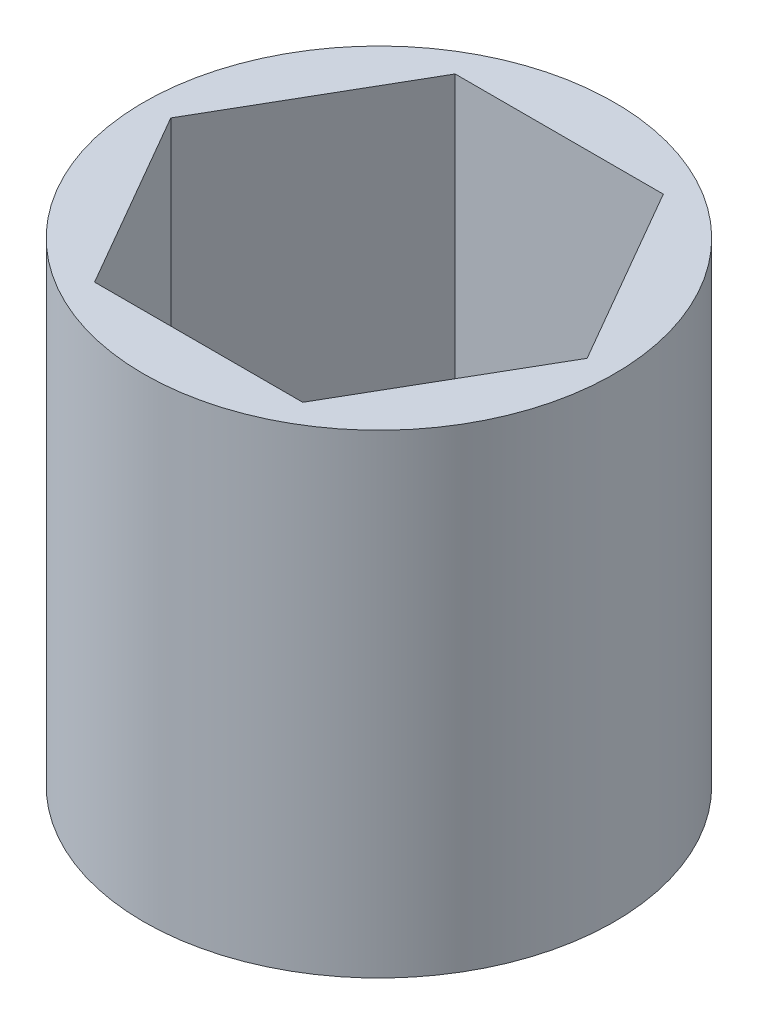
ISO-10303-21;
HEADER;
FILE_DESCRIPTION(('STEP AP214'),'2;1');
FILE_NAME('part.step','',(''),(''),'','','');
FILE_SCHEMA(('AUTOMOTIVE_DESIGN { 1 0 10303 214 1 1 1 1 }'));
ENDSEC;
DATA;
#1=APPLICATION_CONTEXT('core data for automotive mechanical design processes');
#2=APPLICATION_PROTOCOL_DEFINITION('international standard','automotive_design',2000,#1);
#3=PRODUCT_CONTEXT('',#1,'mechanical');
#4=PRODUCT('Part','Part','',(#3));
#5=PRODUCT_RELATED_PRODUCT_CATEGORY('part','',(#4));
#6=PRODUCT_DEFINITION_FORMATION('','',#4);
#7=PRODUCT_DEFINITION_CONTEXT('part definition',#1,'design');
#8=PRODUCT_DEFINITION('design','',#6,#7);
#9=PRODUCT_DEFINITION_SHAPE('','',#8);
#10=(LENGTH_UNIT() NAMED_UNIT(*) SI_UNIT(.MILLI.,.METRE.));
#11=(NAMED_UNIT(*) PLANE_ANGLE_UNIT() SI_UNIT($,.RADIAN.));
#12=(NAMED_UNIT(*) SI_UNIT($,.STERADIAN.) SOLID_ANGLE_UNIT());
#13=UNCERTAINTY_MEASURE_WITH_UNIT(LENGTH_MEASURE(1.E-05),#10,'distance_accuracy_value','');
#14=(GEOMETRIC_REPRESENTATION_CONTEXT(3) GLOBAL_UNCERTAINTY_ASSIGNED_CONTEXT((#13)) GLOBAL_UNIT_ASSIGNED_CONTEXT((#10,
#11,#12)) REPRESENTATION_CONTEXT('',''));
#15=CARTESIAN_POINT('',(0.,0.,0.));
#16=DIRECTION('',(0.,0.,1.));
#17=DIRECTION('',(1.,0.,0.));
#18=AXIS2_PLACEMENT_3D('',#15,#16,#17);
#19=CARTESIAN_POINT('',(0.,12.7,0.));
#20=DIRECTION('',(0.,1.,0.));
#21=DIRECTION('',(0.,0.,1.));
#22=AXIS2_PLACEMENT_3D('',#19,#20,#21);
#23=PLANE('',#22);
#24=CARTESIAN_POINT('',(0.,12.7,0.));
#25=DIRECTION('',(0.,1.,0.));
#26=DIRECTION('',(0.,0.,1.));
#27=AXIS2_PLACEMENT_3D('',#24,#25,#26);
#28=CIRCLE('',#27,6.2992);
#29=CARTESIAN_POINT('',(0.,12.7,6.2992));
#30=VERTEX_POINT('',#29);
#31=EDGE_CURVE('E11',#30,#30,#28,.T.);
#32=ORIENTED_EDGE('',*,*,#31,.T.);
#33=EDGE_LOOP('',(#32));
#34=FACE_BOUND('',#33,.T.);
#35=DIRECTION('',(-0.5,0.,-0.866025403784438));
#36=VECTOR('',#35,1.);
#37=CARTESIAN_POINT('',(5.57258479821827,12.7,0.));
#38=LINE('',#37,#36);
#39=CARTESIAN_POINT('',(5.57258479821827,12.7,0.));
#40=VERTEX_POINT('',#39);
#41=CARTESIAN_POINT('',(2.78629239910913,12.7,-4.826));
#42=VERTEX_POINT('',#41);
#43=EDGE_CURVE('E94',#40,#42,#38,.T.);
#44=ORIENTED_EDGE('',*,*,#43,.F.);
#45=DIRECTION('',(0.5,0.,-0.866025403784439));
#46=VECTOR('',#45,1.);
#47=CARTESIAN_POINT('',(2.78629239910914,12.7,4.826));
#48=LINE('',#47,#46);
#49=CARTESIAN_POINT('',(2.78629239910914,12.7,4.826));
#50=VERTEX_POINT('',#49);
#51=EDGE_CURVE('E86',#50,#40,#48,.T.);
#52=ORIENTED_EDGE('',*,*,#51,.F.);
#53=DIRECTION('',(1.,0.,0.));
#54=VECTOR('',#53,1.);
#55=CARTESIAN_POINT('',(-2.78629239910913,12.7,4.826));
#56=LINE('',#55,#54);
#57=CARTESIAN_POINT('',(-2.78629239910913,12.7,4.826));
#58=VERTEX_POINT('',#57);
#59=EDGE_CURVE('E114',#58,#50,#56,.T.);
#60=ORIENTED_EDGE('',*,*,#59,.F.);
#61=DIRECTION('',(0.5,0.,0.866025403784439));
#62=VECTOR('',#61,1.);
#63=CARTESIAN_POINT('',(-5.57258479821827,12.7,0.));
#64=LINE('',#63,#62);
#65=CARTESIAN_POINT('',(-5.57258479821827,12.7,0.));
#66=VERTEX_POINT('',#65);
#67=EDGE_CURVE('E112',#66,#58,#64,.T.);
#68=ORIENTED_EDGE('',*,*,#67,.F.);
#69=DIRECTION('',(-0.5,0.,0.866025403784439));
#70=VECTOR('',#69,1.);
#71=CARTESIAN_POINT('',(-2.78629239910914,12.7,-4.826));
#72=LINE('',#71,#70);
#73=CARTESIAN_POINT('',(-2.78629239910914,12.7,-4.826));
#74=VERTEX_POINT('',#73);
#75=EDGE_CURVE('E108',#74,#66,#72,.T.);
#76=ORIENTED_EDGE('',*,*,#75,.F.);
#77=DIRECTION('',(-1.,0.,0.));
#78=VECTOR('',#77,1.);
#79=CARTESIAN_POINT('',(2.78629239910913,12.7,-4.826));
#80=LINE('',#79,#78);
#81=EDGE_CURVE('E106',#42,#74,#80,.T.);
#82=ORIENTED_EDGE('',*,*,#81,.F.);
#83=EDGE_LOOP('',(#44,#52,#60,#68,#76,#82));
#84=FACE_BOUND('',#83,.T.);
#85=ADVANCED_FACE('F33',(#34,#84),#23,.T.);
#86=CARTESIAN_POINT('',(0.,0.,0.));
#87=DIRECTION('',(0.,1.,0.));
#88=DIRECTION('',(0.,0.,1.));
#89=AXIS2_PLACEMENT_3D('',#86,#87,#88);
#90=PLANE('',#89);
#91=CARTESIAN_POINT('',(0.,0.,0.));
#92=DIRECTION('',(0.,1.,0.));
#93=DIRECTION('',(0.,0.,1.));
#94=AXIS2_PLACEMENT_3D('',#91,#92,#93);
#95=CIRCLE('',#94,6.2992);
#96=CARTESIAN_POINT('',(0.,0.,6.2992));
#97=VERTEX_POINT('',#96);
#98=EDGE_CURVE('E37',#97,#97,#95,.T.);
#99=ORIENTED_EDGE('',*,*,#98,.F.);
#100=EDGE_LOOP('',(#99));
#101=FACE_BOUND('',#100,.T.);
#102=DIRECTION('',(0.5,0.,-0.866025403784439));
#103=VECTOR('',#102,1.);
#104=CARTESIAN_POINT('',(2.78629239910914,0.,4.826));
#105=LINE('',#104,#103);
#106=CARTESIAN_POINT('',(2.78629239910914,0.,4.826));
#107=VERTEX_POINT('',#106);
#108=CARTESIAN_POINT('',(5.57258479821827,0.,0.));
#109=VERTEX_POINT('',#108);
#110=EDGE_CURVE('E56',#107,#109,#105,.T.);
#111=ORIENTED_EDGE('',*,*,#110,.T.);
#112=DIRECTION('',(-0.5,0.,-0.866025403784438));
#113=VECTOR('',#112,1.);
#114=CARTESIAN_POINT('',(5.57258479821827,0.,0.));
#115=LINE('',#114,#113);
#116=CARTESIAN_POINT('',(2.78629239910913,0.,-4.826));
#117=VERTEX_POINT('',#116);
#118=EDGE_CURVE('E101',#109,#117,#115,.T.);
#119=ORIENTED_EDGE('',*,*,#118,.T.);
#120=DIRECTION('',(-1.,0.,0.));
#121=VECTOR('',#120,1.);
#122=CARTESIAN_POINT('',(2.78629239910913,0.,-4.826));
#123=LINE('',#122,#121);
#124=CARTESIAN_POINT('',(-2.78629239910914,0.,-4.826));
#125=VERTEX_POINT('',#124);
#126=EDGE_CURVE('E118',#117,#125,#123,.T.);
#127=ORIENTED_EDGE('',*,*,#126,.T.);
#128=DIRECTION('',(-0.5,0.,0.866025403784439));
#129=VECTOR('',#128,1.);
#130=CARTESIAN_POINT('',(-2.78629239910914,0.,-4.826));
#131=LINE('',#130,#129);
#132=CARTESIAN_POINT('',(-5.57258479821827,0.,0.));
#133=VERTEX_POINT('',#132);
#134=EDGE_CURVE('E121',#125,#133,#131,.T.);
#135=ORIENTED_EDGE('',*,*,#134,.T.);
#136=DIRECTION('',(0.5,0.,0.866025403784439));
#137=VECTOR('',#136,1.);
#138=CARTESIAN_POINT('',(-5.57258479821827,0.,0.));
#139=LINE('',#138,#137);
#140=CARTESIAN_POINT('',(-2.78629239910913,0.,4.826));
#141=VERTEX_POINT('',#140);
#142=EDGE_CURVE('E124',#133,#141,#139,.T.);
#143=ORIENTED_EDGE('',*,*,#142,.T.);
#144=DIRECTION('',(1.,0.,0.));
#145=VECTOR('',#144,1.);
#146=CARTESIAN_POINT('',(-2.78629239910913,0.,4.826));
#147=LINE('',#146,#145);
#148=EDGE_CURVE('E95',#141,#107,#147,.T.);
#149=ORIENTED_EDGE('',*,*,#148,.T.);
#150=EDGE_LOOP('',(#111,#119,#127,#135,#143,#149));
#151=FACE_BOUND('',#150,.T.);
#152=ADVANCED_FACE('F141',(#101,#151),#90,.F.);
#153=CARTESIAN_POINT('',(0.,12.7,0.));
#154=DIRECTION('',(0.,-1.,0.));
#155=DIRECTION('',(0.,0.,-1.));
#156=AXIS2_PLACEMENT_3D('',#153,#154,#155);
#157=CYLINDRICAL_SURFACE('',#156,6.2992);
#158=ORIENTED_EDGE('',*,*,#31,.F.);
#159=EDGE_LOOP('',(#158));
#160=FACE_BOUND('',#159,.T.);
#161=ORIENTED_EDGE('',*,*,#98,.T.);
#162=EDGE_LOOP('',(#161));
#163=FACE_BOUND('',#162,.T.);
#164=ADVANCED_FACE('F35',(#160,#163),#157,.T.);
#165=CARTESIAN_POINT('',(2.78629239910914,12.7,4.826));
#166=DIRECTION('',(-0.866025403784439,0.,-0.5));
#167=DIRECTION('',(-0.5,0.,0.866025403784439));
#168=AXIS2_PLACEMENT_3D('',#165,#166,#167);
#169=PLANE('',#168);
#170=ORIENTED_EDGE('',*,*,#110,.F.);
#171=DIRECTION('',(0.,-1.,0.));
#172=VECTOR('',#171,1.);
#173=CARTESIAN_POINT('',(2.78629239910914,12.7,4.826));
#174=LINE('',#173,#172);
#175=EDGE_CURVE('E90',#50,#107,#174,.T.);
#176=ORIENTED_EDGE('',*,*,#175,.F.);
#177=ORIENTED_EDGE('',*,*,#51,.T.);
#178=DIRECTION('',(0.,-1.,0.));
#179=VECTOR('',#178,1.);
#180=CARTESIAN_POINT('',(5.57258479821827,12.7,0.));
#181=LINE('',#180,#179);
#182=EDGE_CURVE('E89',#40,#109,#181,.T.);
#183=ORIENTED_EDGE('',*,*,#182,.T.);
#184=EDGE_LOOP('',(#170,#176,#177,#183));
#185=FACE_BOUND('',#184,.T.);
#186=ADVANCED_FACE('F88',(#185),#169,.T.);
#187=CARTESIAN_POINT('',(5.57258479821827,12.7,0.));
#188=DIRECTION('',(-0.866025403784438,0.,0.5));
#189=DIRECTION('',(0.5,0.,0.866025403784439));
#190=AXIS2_PLACEMENT_3D('',#187,#188,#189);
#191=PLANE('',#190);
#192=ORIENTED_EDGE('',*,*,#118,.F.);
#193=ORIENTED_EDGE('',*,*,#182,.F.);
#194=ORIENTED_EDGE('',*,*,#43,.T.);
#195=DIRECTION('',(0.,-1.,0.));
#196=VECTOR('',#195,1.);
#197=CARTESIAN_POINT('',(2.78629239910913,12.7,-4.826));
#198=LINE('',#197,#196);
#199=EDGE_CURVE('E102',#42,#117,#198,.T.);
#200=ORIENTED_EDGE('',*,*,#199,.T.);
#201=EDGE_LOOP('',(#192,#193,#194,#200));
#202=FACE_BOUND('',#201,.T.);
#203=ADVANCED_FACE('F98',(#202),#191,.T.);
#204=CARTESIAN_POINT('',(2.78629239910913,12.7,-4.826));
#205=DIRECTION('',(0.,0.,1.));
#206=DIRECTION('',(1.,0.,0.));
#207=AXIS2_PLACEMENT_3D('',#204,#205,#206);
#208=PLANE('',#207);
#209=ORIENTED_EDGE('',*,*,#126,.F.);
#210=ORIENTED_EDGE('',*,*,#199,.F.);
#211=ORIENTED_EDGE('',*,*,#81,.T.);
#212=DIRECTION('',(0.,-1.,0.));
#213=VECTOR('',#212,1.);
#214=CARTESIAN_POINT('',(-2.78629239910914,12.7,-4.826));
#215=LINE('',#214,#213);
#216=EDGE_CURVE('E133',#74,#125,#215,.T.);
#217=ORIENTED_EDGE('',*,*,#216,.T.);
#218=EDGE_LOOP('',(#209,#210,#211,#217));
#219=FACE_BOUND('',#218,.T.);
#220=ADVANCED_FACE('F137',(#219),#208,.T.);
#221=CARTESIAN_POINT('',(-2.78629239910914,12.7,-4.826));
#222=DIRECTION('',(0.866025403784439,0.,0.5));
#223=DIRECTION('',(0.5,0.,-0.866025403784439));
#224=AXIS2_PLACEMENT_3D('',#221,#222,#223);
#225=PLANE('',#224);
#226=ORIENTED_EDGE('',*,*,#134,.F.);
#227=ORIENTED_EDGE('',*,*,#216,.F.);
#228=ORIENTED_EDGE('',*,*,#75,.T.);
#229=DIRECTION('',(0.,-1.,0.));
#230=VECTOR('',#229,1.);
#231=CARTESIAN_POINT('',(-5.57258479821827,12.7,0.));
#232=LINE('',#231,#230);
#233=EDGE_CURVE('E131',#66,#133,#232,.T.);
#234=ORIENTED_EDGE('',*,*,#233,.T.);
#235=EDGE_LOOP('',(#226,#227,#228,#234));
#236=FACE_BOUND('',#235,.T.);
#237=ADVANCED_FACE('F149',(#236),#225,.T.);
#238=CARTESIAN_POINT('',(-5.57258479821827,12.7,0.));
#239=DIRECTION('',(0.866025403784439,0.,-0.5));
#240=DIRECTION('',(-0.5,0.,-0.866025403784439));
#241=AXIS2_PLACEMENT_3D('',#238,#239,#240);
#242=PLANE('',#241);
#243=ORIENTED_EDGE('',*,*,#142,.F.);
#244=ORIENTED_EDGE('',*,*,#233,.F.);
#245=ORIENTED_EDGE('',*,*,#67,.T.);
#246=DIRECTION('',(0.,-1.,0.));
#247=VECTOR('',#246,1.);
#248=CARTESIAN_POINT('',(-2.78629239910913,12.7,4.826));
#249=LINE('',#248,#247);
#250=EDGE_CURVE('E48',#58,#141,#249,.T.);
#251=ORIENTED_EDGE('',*,*,#250,.T.);
#252=EDGE_LOOP('',(#243,#244,#245,#251));
#253=FACE_BOUND('',#252,.T.);
#254=ADVANCED_FACE('F147',(#253),#242,.T.);
#255=CARTESIAN_POINT('',(-2.78629239910913,12.7,4.826));
#256=DIRECTION('',(0.,0.,-1.));
#257=DIRECTION('',(-1.,0.,0.));
#258=AXIS2_PLACEMENT_3D('',#255,#256,#257);
#259=PLANE('',#258);
#260=ORIENTED_EDGE('',*,*,#148,.F.);
#261=ORIENTED_EDGE('',*,*,#250,.F.);
#262=ORIENTED_EDGE('',*,*,#59,.T.);
#263=ORIENTED_EDGE('',*,*,#175,.T.);
#264=EDGE_LOOP('',(#260,#261,#262,#263));
#265=FACE_BOUND('',#264,.T.);
#266=ADVANCED_FACE('F143',(#265),#259,.T.);
#267=CLOSED_SHELL('',(#85,#152,#164,#186,#203,#220,#237,#254,#266));
#268=MANIFOLD_SOLID_BREP('B2',#267);
#269=ADVANCED_BREP_SHAPE_REPRESENTATION('',(#18,#268),#14);
#270=SHAPE_DEFINITION_REPRESENTATION(#9,#269);
ENDSEC;
END-ISO-10303-21;
